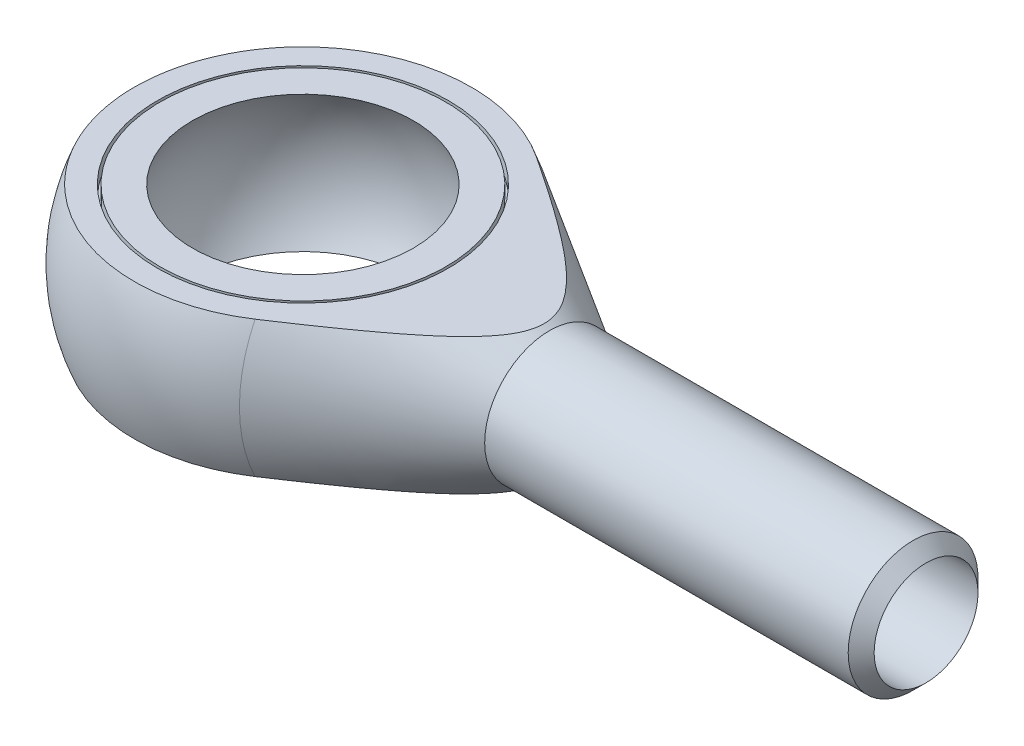
ISO-10303-21;
HEADER;
FILE_DESCRIPTION(('STEP AP214'),'2;1');
FILE_NAME('part.step','',(''),(''),'','','');
FILE_SCHEMA(('AUTOMOTIVE_DESIGN { 1 0 10303 214 1 1 1 1 }'));
ENDSEC;
DATA;
#1=APPLICATION_CONTEXT('core data for automotive mechanical design processes');
#2=APPLICATION_PROTOCOL_DEFINITION('international standard','automotive_design',2000,#1);
#3=PRODUCT_CONTEXT('',#1,'mechanical');
#4=PRODUCT('Part','Part','',(#3));
#5=PRODUCT_RELATED_PRODUCT_CATEGORY('part','',(#4));
#6=PRODUCT_DEFINITION_FORMATION('','',#4);
#7=PRODUCT_DEFINITION_CONTEXT('part definition',#1,'design');
#8=PRODUCT_DEFINITION('design','',#6,#7);
#9=PRODUCT_DEFINITION_SHAPE('','',#8);
#10=(LENGTH_UNIT() NAMED_UNIT(*) SI_UNIT(.MILLI.,.METRE.));
#11=(NAMED_UNIT(*) PLANE_ANGLE_UNIT() SI_UNIT($,.RADIAN.));
#12=(NAMED_UNIT(*) SI_UNIT($,.STERADIAN.) SOLID_ANGLE_UNIT());
#13=UNCERTAINTY_MEASURE_WITH_UNIT(LENGTH_MEASURE(1.E-05),#10,'distance_accuracy_value','');
#14=(GEOMETRIC_REPRESENTATION_CONTEXT(3) GLOBAL_UNCERTAINTY_ASSIGNED_CONTEXT((#13)) GLOBAL_UNIT_ASSIGNED_CONTEXT((#10,
#11,#12)) REPRESENTATION_CONTEXT('',''));
#15=CARTESIAN_POINT('',(0.,0.,0.));
#16=DIRECTION('',(0.,0.,1.));
#17=DIRECTION('',(1.,0.,0.));
#18=AXIS2_PLACEMENT_3D('',#15,#16,#17);
#19=CARTESIAN_POINT('',(-14.,-5.25,-14.));
#20=DIRECTION('',(0.,1.,0.));
#21=DIRECTION('',(-1.,0.,0.));
#22=AXIS2_PLACEMENT_3D('',#19,#20,#21);
#23=PLANE('',#22);
#24=CARTESIAN_POINT('',(-2.62818235817956,-5.25,-17.0529191294828));
#25=CARTESIAN_POINT('',(-2.12503925499544,-5.25,-16.740303282458));
#26=CARTESIAN_POINT('',(-1.62221858295466,-5.25,-16.4271671335793));
#27=CARTESIAN_POINT('',(-0.617367114570737,-5.25,-15.7996232494234));
#28=CARTESIAN_POINT('',(-0.115336323205009,-5.25,-15.4852155061775));
#29=CARTESIAN_POINT('',(0.887915718025678,-5.25,-14.8548186355239));
#30=CARTESIAN_POINT('',(1.38913672077651,-5.25,-14.5388291146458));
#31=CARTESIAN_POINT('',(2.390434330808,-5.25,-13.905043827528));
#32=CARTESIAN_POINT('',(2.89051094079584,-5.25,-13.5872480655673));
#33=CARTESIAN_POINT('',(3.88952679531665,-5.25,-12.949285653447));
#34=CARTESIAN_POINT('',(4.38846528924003,-5.25,-12.6291178270567));
#35=CARTESIAN_POINT('',(5.3845840962432,-5.25,-11.986059462695));
#36=CARTESIAN_POINT('',(5.88176441416815,-5.25,-11.6631689322352));
#37=CARTESIAN_POINT('',(6.87382058369508,-5.25,-11.0140079449249));
#38=CARTESIAN_POINT('',(7.36869673812716,-5.25,-10.6877379515086));
#39=CARTESIAN_POINT('',(8.35552219005812,-5.25,-10.0308094348554));
#40=CARTESIAN_POINT('',(8.84747152387629,-5.25,-9.70015096624085));
#41=CARTESIAN_POINT('',(9.82719732570562,-5.25,-9.0332528700338));
#42=CARTESIAN_POINT('',(10.3149759123961,-5.25,-8.69701636701805));
#43=CARTESIAN_POINT('',(11.042584223956,-5.25,-8.18676697464057));
#44=CARTESIAN_POINT('',(11.2844683213674,-5.25,-8.01568356352145));
#45=CARTESIAN_POINT('',(11.7665787764048,-5.25,-7.67119862410336));
#46=CARTESIAN_POINT('',(12.0068051509764,-5.25,-7.49779711955361));
#47=CARTESIAN_POINT('',(12.4857593495335,-5.25,-7.14785888043862));
#48=CARTESIAN_POINT('',(12.7244828388475,-5.25,-6.97131620446748));
#49=CARTESIAN_POINT('',(13.1994212805954,-5.25,-6.61489315604911));
#50=CARTESIAN_POINT('',(13.4356362927845,-5.25,-6.43501286338981));
#51=CARTESIAN_POINT('',(13.9048300561061,-5.25,-6.07123283389012));
#52=CARTESIAN_POINT('',(14.1378098789113,-5.25,-5.88733448263758));
#53=CARTESIAN_POINT('',(14.5996894514784,-5.25,-5.51449464110692));
#54=CARTESIAN_POINT('',(14.8285894750344,-5.25,-5.32555349139113));
#55=CARTESIAN_POINT('',(15.282237951272,-5.25,-4.94025179508472));
#56=CARTESIAN_POINT('',(15.5069568251484,-5.25,-4.74385630094497));
#57=CARTESIAN_POINT('',(15.9490800000814,-5.25,-4.3426854061068));
#58=CARTESIAN_POINT('',(16.1664805475941,-5.25,-4.13790582106398));
#59=CARTESIAN_POINT('',(16.484175513211,-5.25,-3.82297089010626));
#60=CARTESIAN_POINT('',(16.5885036572486,-5.25,-3.71688406262262));
#61=CARTESIAN_POINT('',(16.7938964577246,-5.25,-3.50160431070215));
#62=CARTESIAN_POINT('',(16.8949614463307,-5.25,-3.39241170455501));
#63=CARTESIAN_POINT('',(17.0930053198843,-5.25,-3.17053617094147));
#64=CARTESIAN_POINT('',(17.1899876198046,-5.25,-3.05785630304538));
#65=CARTESIAN_POINT('',(17.3789511612546,-5.25,-2.82839690184453));
#66=CARTESIAN_POINT('',(17.4709336511534,-5.25,-2.71161840399449));
#67=CARTESIAN_POINT('',(17.6291413848074,-5.25,-2.49944002389789));
#68=CARTESIAN_POINT('',(17.696595836885,-5.25,-2.40495915388657));
#69=CARTESIAN_POINT('',(17.8268589672254,-5.25,-2.21282440774173));
#70=CARTESIAN_POINT('',(17.8896673813928,-5.25,-2.11517035168785));
#71=CARTESIAN_POINT('',(18.009635932278,-5.25,-1.9164265976122));
#72=CARTESIAN_POINT('',(18.0667965305289,-5.25,-1.81533718123305));
#73=CARTESIAN_POINT('',(18.1742438069796,-5.25,-1.6096078237905));
#74=CARTESIAN_POINT('',(18.2245314358917,-5.25,-1.50496837629427));
#75=CARTESIAN_POINT('',(18.3497528940346,-5.25,-1.21600906528184));
#76=CARTESIAN_POINT('',(18.4167302354102,-5.25,-1.02802016789579));
#77=CARTESIAN_POINT('',(18.4930440705706,-5.25,-0.739890839703954));
#78=CARTESIAN_POINT('',(18.5144521575709,-5.25,-0.642871492398333));
#79=CARTESIAN_POINT('',(18.5484628500599,-5.25,-0.447270685231269));
#80=CARTESIAN_POINT('',(18.5610658926043,-5.25,-0.348689303152924));
#81=CARTESIAN_POINT('',(18.5769635243127,-5.25,-0.150015657254014));
#82=CARTESIAN_POINT('',(18.5801863158179,-5.25,-0.0499176044822042));
#83=CARTESIAN_POINT('',(18.5769714195661,-5.25,0.150120621250944));
#84=CARTESIAN_POINT('',(18.5705338544787,-5.25,0.250060796200922));
#85=CARTESIAN_POINT('',(18.5482916604935,-5.25,0.44891994571496));
#86=CARTESIAN_POINT('',(18.5324834582833,-5.25,0.54783851606183));
#87=CARTESIAN_POINT('',(18.4921752626354,-5.25,0.743880072769976));
#88=CARTESIAN_POINT('',(18.4676738423316,-5.25,0.841002761608293));
#89=CARTESIAN_POINT('',(18.4030178370912,-5.25,1.05951947659546));
#90=CARTESIAN_POINT('',(18.360407363697,-5.25,1.18018551122314));
#91=CARTESIAN_POINT('',(18.2645531151317,-5.25,1.41723280305831));
#92=CARTESIAN_POINT('',(18.2113025185034,-5.25,1.5336112544834));
#93=CARTESIAN_POINT('',(18.0959496874158,-5.25,1.76234613587608));
#94=CARTESIAN_POINT('',(18.0338181448365,-5.25,1.8746876430235));
#95=CARTESIAN_POINT('',(17.9025326089589,-5.25,2.095123692322));
#96=CARTESIAN_POINT('',(17.8333797170092,-5.25,2.20321889685798));
#97=CARTESIAN_POINT('',(17.6573498992889,-5.25,2.46282784370737));
#98=CARTESIAN_POINT('',(17.5473864507267,-5.25,2.61224250439258));
#99=CARTESIAN_POINT('',(17.3186817963039,-5.25,2.9042315509107));
#100=CARTESIAN_POINT('',(17.1999358030278,-5.25,3.04680213512871));
#101=CARTESIAN_POINT('',(16.9555901353059,-5.25,3.32643804958606));
#102=CARTESIAN_POINT('',(16.8299765619883,-5.25,3.46349116141572));
#103=CARTESIAN_POINT('',(16.5736806662698,-5.25,3.73269293974768));
#104=CARTESIAN_POINT('',(16.4429993375533,-5.25,3.86484255788085));
#105=CARTESIAN_POINT('',(16.1759566610267,-5.25,4.12669787579271));
#106=CARTESIAN_POINT('',(16.0395443093411,-5.25,4.25635135774169));
#107=CARTESIAN_POINT('',(15.7634463943519,-5.25,4.51212441398327));
#108=CARTESIAN_POINT('',(15.6237606979427,-5.25,4.63824384410948));
#109=CARTESIAN_POINT('',(15.3419298093293,-5.25,4.8873101582602));
#110=CARTESIAN_POINT('',(15.1997881764243,-5.25,5.01026107978952));
#111=CARTESIAN_POINT('',(14.9133363689628,-5.25,5.25359292827943));
#112=CARTESIAN_POINT('',(14.769026281115,-5.25,5.37397395753738));
#113=CARTESIAN_POINT('',(14.4477350601348,-5.25,5.63787621994563));
#114=CARTESIAN_POINT('',(14.2703280946363,-5.25,5.78087853406915));
#115=CARTESIAN_POINT('',(13.9133412580273,-5.25,6.0641479750078));
#116=CARTESIAN_POINT('',(13.7337613250484,-5.25,6.20441502364662));
#117=CARTESIAN_POINT('',(13.1923063020175,-5.25,6.62177574528827));
#118=CARTESIAN_POINT('',(12.8277547678615,-5.25,6.89539748447187));
#119=CARTESIAN_POINT('',(12.0934702302581,-5.25,7.4359017097799));
#120=CARTESIAN_POINT('',(11.7237349982163,-5.25,7.70278114989576));
#121=CARTESIAN_POINT('',(10.9805280997887,-5.25,8.2312963803654));
#122=CARTESIAN_POINT('',(10.6070563383385,-5.25,8.49293203679625));
#123=CARTESIAN_POINT('',(9.85639903737001,-5.25,9.01270604814966));
#124=CARTESIAN_POINT('',(9.47920685092815,-5.25,9.27083478277498));
#125=CARTESIAN_POINT('',(8.72259081692942,-5.25,9.78380733628525));
#126=CARTESIAN_POINT('',(8.34316693940603,-5.25,10.0386511109134));
#127=CARTESIAN_POINT('',(7.58265098105799,-5.25,10.5456024384322));
#128=CARTESIAN_POINT('',(7.20155939730992,-5.25,10.7977107378063));
#129=CARTESIAN_POINT('',(6.43793449283945,-5.25,11.2997341533576));
#130=CARTESIAN_POINT('',(6.05540116898126,-5.25,11.5496492647606));
#131=CARTESIAN_POINT('',(4.99343088142394,-5.25,12.2398634735995));
#132=CARTESIAN_POINT('',(4.31273060646974,-5.25,12.67821851924));
#133=CARTESIAN_POINT('',(2.94857560369635,-5.25,13.5507372381671));
#134=CARTESIAN_POINT('',(2.2651206545807,-5.25,13.9849005648002));
#135=CARTESIAN_POINT('',(0.899005973709454,-5.25,14.8482114756042));
#136=CARTESIAN_POINT('',(0.216354652490301,-5.25,15.2773723802271));
#137=CARTESIAN_POINT('',(-1.15047237131164,-5.25,16.1331105629131));
#138=CARTESIAN_POINT('',(-1.83464791706178,-5.25,16.5596880913868));
#139=CARTESIAN_POINT('',(-2.51940505629375,-5.25,16.9853239876288));
#140=B_SPLINE_CURVE_WITH_KNOTS('',3,(#24,#25,#26,#27,#28,#29,#30,#31,#32,#33,#34,#35,#36,#37,
#38,#39,#40,#41,#42,#43,#44,#45,#46,#47,#48,#49,#50,#51,#52,#53,#54,#55,#56,#57,#58,#59,#60,#61,
#62,#63,#64,#65,#66,#67,#68,#69,#70,#71,#72,#73,#74,#75,#76,#77,#78,#79,#80,#81,#82,#83,#84,#85,
#86,#87,#88,#89,#90,#91,#92,#93,#94,#95,#96,#97,#98,#99,#100,#101,#102,#103,#104,#105,#106,#107,
#108,#109,#110,#111,#112,#113,#114,#115,#116,#117,#118,#119,#120,#121,#122,#123,#124,#125,#126,
#127,#128,#129,#130,#131,#132,#133,#134,#135,#136,#137,#138,#139),.UNSPECIFIED.,.F.,.F.,(4,2,2,
2,2,2,2,2,2,2,2,2,2,2,2,2,2,2,2,2,2,2,2,2,2,2,2,2,2,2,2,2,2,2,2,2,2,2,2,2,2,2,2,2,2,2,2,2,2,2,2,
2,2,2,2,2,2,4),(0.,1.77705867525193,3.55412850410732,5.33166484098367,7.1091969685531,
8.88767899646891,10.6661561194538,12.4443925020109,14.222606771986,15.9998565154504,
16.888663635955,17.7774616574648,18.6681714167051,19.5588599103007,20.4492459606338,
21.3395720306826,22.2347709687872,23.1304222643625,23.5767423874506,24.0230169339339,
24.4689104590565,24.9146921357371,25.2628458954984,25.6110194302212,25.9591644890214,
26.3072613413689,26.9032888932806,27.201016684591,27.4987296965497,27.7987155262954,
28.0986975467798,28.3987940332906,28.6989397991018,29.0822160341973,29.4657387833532,
29.8505577463786,30.2353164407978,30.7914004098707,31.3477897698923,31.9053501578489,
32.4628017668784,33.0273200934349,33.5918614152522,34.1556437112237,34.7194035232227,
35.4029674555354,36.086550896162,37.4538676290173,38.8217914190748,40.1897501006391,
41.5609109641764,42.9320902815018,44.3028854988715,45.6736836994411,48.1025633447862,
50.5316421659497,52.950670300135,55.3694600757206),.UNSPECIFIED.);
#141=CARTESIAN_POINT('',(7.14797043355877,-5.25,10.832544423217));
#142=VERTEX_POINT('',#141);
#143=CARTESIAN_POINT('',(7.14797043355877,-5.25,-10.832544423217));
#144=VERTEX_POINT('',#143);
#145=EDGE_CURVE('E41',#142,#144,#140,.F.);
#146=ORIENTED_EDGE('',*,*,#145,.F.);
#147=CARTESIAN_POINT('',(0.,-5.25,0.));
#148=DIRECTION('',(0.,1.,0.));
#149=DIRECTION('',(-1.,0.,0.));
#150=AXIS2_PLACEMENT_3D('',#147,#148,#149);
#151=CIRCLE('',#150,12.9783473524174);
#152=EDGE_CURVE('E47',#144,#142,#151,.T.);
#153=ORIENTED_EDGE('',*,*,#152,.F.);
#154=EDGE_LOOP('',(#146,#153));
#155=FACE_BOUND('',#154,.T.);
#156=CARTESIAN_POINT('',(0.,-5.25,0.));
#157=DIRECTION('',(0.,1.,0.));
#158=DIRECTION('',(0.,0.,1.));
#159=AXIS2_PLACEMENT_3D('',#156,#157,#158);
#160=CIRCLE('',#159,11.2);
#161=CARTESIAN_POINT('',(0.,-5.25,11.2));
#162=VERTEX_POINT('',#161);
#163=EDGE_CURVE('E157',#162,#162,#160,.T.);
#164=ORIENTED_EDGE('',*,*,#163,.T.);
#165=EDGE_LOOP('',(#164));
#166=FACE_BOUND('',#165,.T.);
#167=ADVANCED_FACE('F33',(#155,#166),#23,.F.);
#168=CARTESIAN_POINT('',(0.,-5.25,0.));
#169=DIRECTION('',(0.,1.,0.));
#170=DIRECTION('',(-1.,0.,0.));
#171=AXIS2_PLACEMENT_3D('',#168,#169,#170);
#172=CIRCLE('',#171,8.5110222652746);
#173=CARTESIAN_POINT('',(8.5110222652746,-5.25,0.));
#174=VERTEX_POINT('',#173);
#175=EDGE_CURVE('E172',#174,#174,#172,.F.);
#176=ORIENTED_EDGE('',*,*,#175,.F.);
#177=EDGE_LOOP('',(#176));
#178=FACE_BOUND('',#177,.T.);
#179=CARTESIAN_POINT('',(0.,-5.25,0.));
#180=DIRECTION('',(0.,1.,0.));
#181=DIRECTION('',(0.,0.,1.));
#182=AXIS2_PLACEMENT_3D('',#179,#180,#181);
#183=CIRCLE('',#182,11.);
#184=CARTESIAN_POINT('',(0.,-5.25,11.));
#185=VERTEX_POINT('',#184);
#186=EDGE_CURVE('E144',#185,#185,#183,.T.);
#187=ORIENTED_EDGE('',*,*,#186,.F.);
#188=EDGE_LOOP('',(#187));
#189=FACE_BOUND('',#188,.T.);
#190=ADVANCED_FACE('F91',(#178,#189),#23,.F.);
#191=CARTESIAN_POINT('',(-14.,5.25,-14.));
#192=DIRECTION('',(0.,-1.,0.));
#193=DIRECTION('',(1.,0.,0.));
#194=AXIS2_PLACEMENT_3D('',#191,#192,#193);
#195=PLANE('',#194);
#196=CARTESIAN_POINT('',(0.,5.25,0.));
#197=DIRECTION('',(0.,-1.,0.));
#198=DIRECTION('',(1.,0.,0.));
#199=AXIS2_PLACEMENT_3D('',#196,#197,#198);
#200=CIRCLE('',#199,8.5110222652746);
#201=CARTESIAN_POINT('',(8.5110222652746,5.25,0.));
#202=VERTEX_POINT('',#201);
#203=EDGE_CURVE('E69',#202,#202,#200,.F.);
#204=ORIENTED_EDGE('',*,*,#203,.F.);
#205=EDGE_LOOP('',(#204));
#206=FACE_BOUND('',#205,.T.);
#207=CARTESIAN_POINT('',(0.,5.25,0.));
#208=DIRECTION('',(0.,1.,0.));
#209=DIRECTION('',(0.,0.,1.));
#210=AXIS2_PLACEMENT_3D('',#207,#208,#209);
#211=CIRCLE('',#210,11.);
#212=CARTESIAN_POINT('',(0.,5.25,11.));
#213=VERTEX_POINT('',#212);
#214=EDGE_CURVE('E160',#213,#213,#211,.T.);
#215=ORIENTED_EDGE('',*,*,#214,.T.);
#216=EDGE_LOOP('',(#215));
#217=FACE_BOUND('',#216,.T.);
#218=ADVANCED_FACE('F87',(#206,#217),#195,.F.);
#219=CARTESIAN_POINT('',(-2.62818235817956,5.25,-17.0529191294828));
#220=CARTESIAN_POINT('',(-2.12503925499544,5.25,-16.740303282458));
#221=CARTESIAN_POINT('',(-1.62221858295466,5.25,-16.4271671335793));
#222=CARTESIAN_POINT('',(-0.617367114570737,5.25,-15.7996232494234));
#223=CARTESIAN_POINT('',(-0.115336323205009,5.25,-15.4852155061775));
#224=CARTESIAN_POINT('',(0.887915718025678,5.25,-14.8548186355239));
#225=CARTESIAN_POINT('',(1.38913672077651,5.25,-14.5388291146458));
#226=CARTESIAN_POINT('',(2.390434330808,5.25,-13.905043827528));
#227=CARTESIAN_POINT('',(2.89051094079584,5.25,-13.5872480655673));
#228=CARTESIAN_POINT('',(3.88952679531665,5.25,-12.949285653447));
#229=CARTESIAN_POINT('',(4.38846528924003,5.25,-12.6291178270567));
#230=CARTESIAN_POINT('',(5.3845840962432,5.25,-11.986059462695));
#231=CARTESIAN_POINT('',(5.88176441416815,5.25,-11.6631689322352));
#232=CARTESIAN_POINT('',(6.87382058369508,5.25,-11.0140079449249));
#233=CARTESIAN_POINT('',(7.36869673812716,5.25,-10.6877379515086));
#234=CARTESIAN_POINT('',(8.35552219005812,5.25,-10.0308094348554));
#235=CARTESIAN_POINT('',(8.84747152387629,5.25,-9.70015096624085));
#236=CARTESIAN_POINT('',(9.82719732570562,5.25,-9.0332528700338));
#237=CARTESIAN_POINT('',(10.3149759123961,5.25,-8.69701636701805));
#238=CARTESIAN_POINT('',(11.042584223956,5.25,-8.18676697464057));
#239=CARTESIAN_POINT('',(11.2844683213674,5.25,-8.01568356352145));
#240=CARTESIAN_POINT('',(11.7665787764048,5.25,-7.67119862410336));
#241=CARTESIAN_POINT('',(12.0068051509764,5.25,-7.49779711955361));
#242=CARTESIAN_POINT('',(12.4857593495335,5.25,-7.14785888043862));
#243=CARTESIAN_POINT('',(12.7244828388475,5.25,-6.97131620446748));
#244=CARTESIAN_POINT('',(13.1994212805954,5.25,-6.61489315604911));
#245=CARTESIAN_POINT('',(13.4356362927845,5.25,-6.43501286338981));
#246=CARTESIAN_POINT('',(13.9048300561061,5.25,-6.07123283389012));
#247=CARTESIAN_POINT('',(14.1378098789113,5.25,-5.88733448263758));
#248=CARTESIAN_POINT('',(14.5996894514784,5.25,-5.51449464110692));
#249=CARTESIAN_POINT('',(14.8285894750344,5.25,-5.32555349139113));
#250=CARTESIAN_POINT('',(15.282237951272,5.25,-4.94025179508472));
#251=CARTESIAN_POINT('',(15.5069568251484,5.25,-4.74385630094497));
#252=CARTESIAN_POINT('',(15.9490800000814,5.25,-4.3426854061068));
#253=CARTESIAN_POINT('',(16.1664805475941,5.25,-4.13790582106398));
#254=CARTESIAN_POINT('',(16.484175513211,5.25,-3.82297089010626));
#255=CARTESIAN_POINT('',(16.5885036572486,5.25,-3.71688406262262));
#256=CARTESIAN_POINT('',(16.7938964577246,5.25,-3.50160431070215));
#257=CARTESIAN_POINT('',(16.8949614463307,5.25,-3.39241170455501));
#258=CARTESIAN_POINT('',(17.0930053198843,5.25,-3.17053617094147));
#259=CARTESIAN_POINT('',(17.1899876198046,5.25,-3.05785630304538));
#260=CARTESIAN_POINT('',(17.3789511612546,5.25,-2.82839690184453));
#261=CARTESIAN_POINT('',(17.4709336511534,5.25,-2.71161840399449));
#262=CARTESIAN_POINT('',(17.6291413848074,5.25,-2.49944002389789));
#263=CARTESIAN_POINT('',(17.696595836885,5.25,-2.40495915388657));
#264=CARTESIAN_POINT('',(17.8268589672254,5.25,-2.21282440774173));
#265=CARTESIAN_POINT('',(17.8896673813928,5.25,-2.11517035168785));
#266=CARTESIAN_POINT('',(18.009635932278,5.25,-1.9164265976122));
#267=CARTESIAN_POINT('',(18.0667965305289,5.25,-1.81533718123305));
#268=CARTESIAN_POINT('',(18.1742438069796,5.25,-1.6096078237905));
#269=CARTESIAN_POINT('',(18.2245314358917,5.25,-1.50496837629427));
#270=CARTESIAN_POINT('',(18.3497528940346,5.25,-1.21600906528184));
#271=CARTESIAN_POINT('',(18.4167302354102,5.25,-1.02802016789579));
#272=CARTESIAN_POINT('',(18.4930440705706,5.25,-0.739890839703954));
#273=CARTESIAN_POINT('',(18.5144521575709,5.25,-0.642871492398333));
#274=CARTESIAN_POINT('',(18.5484628500599,5.25,-0.447270685231269));
#275=CARTESIAN_POINT('',(18.5610658926043,5.25,-0.348689303152924));
#276=CARTESIAN_POINT('',(18.5769635243127,5.25,-0.150015657254014));
#277=CARTESIAN_POINT('',(18.5801863158179,5.25,-0.0499176044822042));
#278=CARTESIAN_POINT('',(18.5769714195661,5.25,0.150120621250944));
#279=CARTESIAN_POINT('',(18.5705338544787,5.25,0.250060796200922));
#280=CARTESIAN_POINT('',(18.5482916604935,5.25,0.44891994571496));
#281=CARTESIAN_POINT('',(18.5324834582833,5.25,0.54783851606183));
#282=CARTESIAN_POINT('',(18.4921752626354,5.25,0.743880072769976));
#283=CARTESIAN_POINT('',(18.4676738423316,5.25,0.841002761608293));
#284=CARTESIAN_POINT('',(18.4030178370912,5.25,1.05951947659546));
#285=CARTESIAN_POINT('',(18.360407363697,5.25,1.18018551122314));
#286=CARTESIAN_POINT('',(18.2645531151317,5.25,1.41723280305831));
#287=CARTESIAN_POINT('',(18.2113025185034,5.25,1.5336112544834));
#288=CARTESIAN_POINT('',(18.0959496874158,5.25,1.76234613587608));
#289=CARTESIAN_POINT('',(18.0338181448365,5.25,1.8746876430235));
#290=CARTESIAN_POINT('',(17.9025326089589,5.25,2.095123692322));
#291=CARTESIAN_POINT('',(17.8333797170092,5.25,2.20321889685798));
#292=CARTESIAN_POINT('',(17.6573498992889,5.25,2.46282784370737));
#293=CARTESIAN_POINT('',(17.5473864507267,5.25,2.61224250439258));
#294=CARTESIAN_POINT('',(17.3186817963039,5.25,2.9042315509107));
#295=CARTESIAN_POINT('',(17.1999358030278,5.25,3.04680213512871));
#296=CARTESIAN_POINT('',(16.9555901353059,5.25,3.32643804958606));
#297=CARTESIAN_POINT('',(16.8299765619883,5.25,3.46349116141572));
#298=CARTESIAN_POINT('',(16.5736806662698,5.25,3.73269293974768));
#299=CARTESIAN_POINT('',(16.4429993375533,5.25,3.86484255788085));
#300=CARTESIAN_POINT('',(16.1759566610267,5.25,4.12669787579271));
#301=CARTESIAN_POINT('',(16.0395443093411,5.25,4.25635135774169));
#302=CARTESIAN_POINT('',(15.7634463943519,5.25,4.51212441398327));
#303=CARTESIAN_POINT('',(15.6237606979427,5.25,4.63824384410948));
#304=CARTESIAN_POINT('',(15.3419298093293,5.25,4.8873101582602));
#305=CARTESIAN_POINT('',(15.1997881764243,5.25,5.01026107978952));
#306=CARTESIAN_POINT('',(14.9133363689628,5.25,5.25359292827943));
#307=CARTESIAN_POINT('',(14.769026281115,5.25,5.37397395753738));
#308=CARTESIAN_POINT('',(14.4477350601348,5.25,5.63787621994563));
#309=CARTESIAN_POINT('',(14.2703280946363,5.25,5.78087853406915));
#310=CARTESIAN_POINT('',(13.9133412580273,5.25,6.0641479750078));
#311=CARTESIAN_POINT('',(13.7337613250484,5.25,6.20441502364662));
#312=CARTESIAN_POINT('',(13.1923063020175,5.25,6.62177574528827));
#313=CARTESIAN_POINT('',(12.8277547678615,5.25,6.89539748447187));
#314=CARTESIAN_POINT('',(12.0934702302581,5.25,7.4359017097799));
#315=CARTESIAN_POINT('',(11.7237349982163,5.25,7.70278114989576));
#316=CARTESIAN_POINT('',(10.9805280997887,5.25,8.2312963803654));
#317=CARTESIAN_POINT('',(10.6070563383385,5.25,8.49293203679625));
#318=CARTESIAN_POINT('',(9.85639903737001,5.25,9.01270604814966));
#319=CARTESIAN_POINT('',(9.47920685092815,5.25,9.27083478277498));
#320=CARTESIAN_POINT('',(8.72259081692942,5.25,9.78380733628525));
#321=CARTESIAN_POINT('',(8.34316693940603,5.25,10.0386511109134));
#322=CARTESIAN_POINT('',(7.58265098105799,5.25,10.5456024384322));
#323=CARTESIAN_POINT('',(7.20155939730992,5.25,10.7977107378063));
#324=CARTESIAN_POINT('',(6.43793449283945,5.25,11.2997341533576));
#325=CARTESIAN_POINT('',(6.05540116898126,5.25,11.5496492647606));
#326=CARTESIAN_POINT('',(4.99343088142394,5.25,12.2398634735995));
#327=CARTESIAN_POINT('',(4.31273060646974,5.25,12.67821851924));
#328=CARTESIAN_POINT('',(2.94857560369635,5.25,13.5507372381671));
#329=CARTESIAN_POINT('',(2.2651206545807,5.25,13.9849005648002));
#330=CARTESIAN_POINT('',(0.899005973709454,5.25,14.8482114756042));
#331=CARTESIAN_POINT('',(0.216354652490301,5.25,15.2773723802271));
#332=CARTESIAN_POINT('',(-1.15047237131164,5.25,16.1331105629131));
#333=CARTESIAN_POINT('',(-1.83464791706178,5.25,16.5596880913868));
#334=CARTESIAN_POINT('',(-2.51940505629375,5.25,16.9853239876288));
#335=B_SPLINE_CURVE_WITH_KNOTS('',3,(#219,#220,#221,#222,#223,#224,#225,#226,#227,#228,#229,
#230,#231,#232,#233,#234,#235,#236,#237,#238,#239,#240,#241,#242,#243,#244,#245,#246,#247,#248,
#249,#250,#251,#252,#253,#254,#255,#256,#257,#258,#259,#260,#261,#262,#263,#264,#265,#266,#267,
#268,#269,#270,#271,#272,#273,#274,#275,#276,#277,#278,#279,#280,#281,#282,#283,#284,#285,#286,
#287,#288,#289,#290,#291,#292,#293,#294,#295,#296,#297,#298,#299,#300,#301,#302,#303,#304,#305,
#306,#307,#308,#309,#310,#311,#312,#313,#314,#315,#316,#317,#318,#319,#320,#321,#322,#323,#324,
#325,#326,#327,#328,#329,#330,#331,#332,#333,#334),.UNSPECIFIED.,.F.,.F.,(4,2,2,2,2,2,2,2,2,2,2,
2,2,2,2,2,2,2,2,2,2,2,2,2,2,2,2,2,2,2,2,2,2,2,2,2,2,2,2,2,2,2,2,2,2,2,2,2,2,2,2,2,2,2,2,2,2,4),
(0.,1.77705867525193,3.55412850410732,5.33166484098367,7.1091969685531,8.88767899646891,
10.6661561194538,12.4443925020109,14.222606771986,15.9998565154504,16.888663635955,
17.7774616574648,18.6681714167051,19.5588599103007,20.4492459606338,21.3395720306826,
22.2347709687872,23.1304222643625,23.5767423874506,24.0230169339339,24.4689104590565,
24.9146921357371,25.2628458954984,25.6110194302212,25.9591644890214,26.3072613413689,
26.9032888932806,27.201016684591,27.4987296965497,27.7987155262954,28.0986975467798,
28.3987940332906,28.6989397991018,29.0822160341973,29.4657387833532,29.8505577463786,
30.2353164407978,30.7914004098707,31.3477897698923,31.9053501578489,32.4628017668784,
33.0273200934349,33.5918614152522,34.1556437112237,34.7194035232227,35.4029674555354,
36.086550896162,37.4538676290173,38.8217914190748,40.1897501006391,41.5609109641764,
42.9320902815018,44.3028854988715,45.6736836994411,48.1025633447862,50.5316421659497,
52.950670300135,55.3694600757206),.UNSPECIFIED.);
#336=CARTESIAN_POINT('',(7.14797043355878,5.25,-10.832544423217));
#337=VERTEX_POINT('',#336);
#338=CARTESIAN_POINT('',(7.14797043355877,5.25,10.832544423217));
#339=VERTEX_POINT('',#338);
#340=EDGE_CURVE('E64',#337,#339,#335,.T.);
#341=ORIENTED_EDGE('',*,*,#340,.F.);
#342=CARTESIAN_POINT('',(0.,5.25,0.));
#343=DIRECTION('',(0.,-1.,0.));
#344=DIRECTION('',(1.,0.,0.));
#345=AXIS2_PLACEMENT_3D('',#342,#343,#344);
#346=CIRCLE('',#345,12.9783473524174);
#347=EDGE_CURVE('E68',#339,#337,#346,.T.);
#348=ORIENTED_EDGE('',*,*,#347,.F.);
#349=EDGE_LOOP('',(#341,#348));
#350=FACE_BOUND('',#349,.T.);
#351=CARTESIAN_POINT('',(0.,5.25,0.));
#352=DIRECTION('',(0.,1.,0.));
#353=DIRECTION('',(0.,0.,1.));
#354=AXIS2_PLACEMENT_3D('',#351,#352,#353);
#355=CIRCLE('',#354,11.2);
#356=CARTESIAN_POINT('',(0.,5.25,11.2));
#357=VERTEX_POINT('',#356);
#358=EDGE_CURVE('E163',#357,#357,#355,.T.);
#359=ORIENTED_EDGE('',*,*,#358,.F.);
#360=EDGE_LOOP('',(#359));
#361=FACE_BOUND('',#360,.T.);
#362=ADVANCED_FACE('F90',(#350,#361),#195,.F.);
#363=CARTESIAN_POINT('',(0.,0.,0.));
#364=DIRECTION('',(-1.,0.,0.));
#365=DIRECTION('',(0.,0.,-1.));
#366=AXIS2_PLACEMENT_3D('',#363,#364,#365);
#367=SPHERICAL_SURFACE('',#366,14.);
#368=CARTESIAN_POINT('',(7.14797043355877,0.,0.));
#369=DIRECTION('',(-1.,0.,0.));
#370=DIRECTION('',(0.,0.,1.));
#371=AXIS2_PLACEMENT_3D('',#368,#369,#370);
#372=CIRCLE('',#371,12.0377123524767);
#373=EDGE_CURVE('E67',#337,#144,#372,.T.);
#374=ORIENTED_EDGE('',*,*,#373,.T.);
#375=ORIENTED_EDGE('',*,*,#152,.T.);
#376=EDGE_CURVE('E54',#142,#339,#372,.T.);
#377=ORIENTED_EDGE('',*,*,#376,.T.);
#378=ORIENTED_EDGE('',*,*,#347,.T.);
#379=EDGE_LOOP('',(#374,#375,#377,#378));
#380=FACE_BOUND('',#379,.T.);
#381=ADVANCED_FACE('F66',(#380),#367,.T.);
#382=CARTESIAN_POINT('',(19.,0.,0.));
#383=DIRECTION('',(-1.,0.,0.));
#384=DIRECTION('',(0.,0.,1.));
#385=AXIS2_PLACEMENT_3D('',#382,#383,#384);
#386=CONICAL_SURFACE('',#385,5.,0.535846782161462);
#387=ORIENTED_EDGE('',*,*,#376,.F.);
#388=ORIENTED_EDGE('',*,*,#145,.T.);
#389=ORIENTED_EDGE('',*,*,#373,.F.);
#390=ORIENTED_EDGE('',*,*,#340,.T.);
#391=EDGE_LOOP('',(#387,#388,#389,#390));
#392=FACE_BOUND('',#391,.T.);
#393=CARTESIAN_POINT('',(19.,0.,0.));
#394=DIRECTION('',(1.,0.,0.));
#395=DIRECTION('',(0.,0.,-1.));
#396=AXIS2_PLACEMENT_3D('',#393,#394,#395);
#397=CIRCLE('',#396,5.);
#398=CARTESIAN_POINT('',(19.,0.,5.));
#399=VERTEX_POINT('',#398);
#400=EDGE_CURVE('E140',#399,#399,#397,.T.);
#401=ORIENTED_EDGE('',*,*,#400,.F.);
#402=EDGE_LOOP('',(#401));
#403=FACE_BOUND('',#402,.T.);
#404=ADVANCED_FACE('F72',(#392,#403),#386,.T.);
#405=CARTESIAN_POINT('',(0.,0.,0.));
#406=DIRECTION('',(0.,1.,0.));
#407=DIRECTION('',(1.,0.,0.));
#408=AXIS2_PLACEMENT_3D('',#405,#406,#407);
#409=SPHERICAL_SURFACE('',#408,10.);
#410=CARTESIAN_POINT('',(8.5110222652746,-5.25,0.));
#411=CARTESIAN_POINT('',(8.57147622073668,-5.15199686805598,0.));
#412=CARTESIAN_POINT('',(8.63023597393296,-5.05294873214638,0.));
#413=CARTESIAN_POINT('',(8.74430021425778,-4.85288249220074,0.));
#414=CARTESIAN_POINT('',(8.79960470138633,-4.75186438816471,0.));
#415=CARTESIAN_POINT('',(8.90669154803957,-4.54797825177098,0.));
#416=CARTESIAN_POINT('',(8.95847390756427,-4.44511021941328,0.));
#417=CARTESIAN_POINT('',(9.05845494486029,-4.23764710338871,0.));
#418=CARTESIAN_POINT('',(9.10665362263163,-4.13305201972184,0.));
#419=CARTESIAN_POINT('',(9.19940972237268,-3.9222595700734,0.));
#420=CARTESIAN_POINT('',(9.24396714434239,-3.81606220409182,0.));
#421=CARTESIAN_POINT('',(9.32938758255673,-3.60219191589988,0.));
#422=CARTESIAN_POINT('',(9.37025059880136,-3.49451899368952,0.));
#423=CARTESIAN_POINT('',(9.4482334626182,-3.2778260676683,0.));
#424=CARTESIAN_POINT('',(9.48535331019042,-3.16880606385744,0.));
#425=CARTESIAN_POINT('',(9.55580554582315,-2.94954905987119,0.));
#426=CARTESIAN_POINT('',(9.58913793388367,-2.83931205969579,0.));
#427=CARTESIAN_POINT('',(9.65197547738992,-2.61775259948757,0.));
#428=CARTESIAN_POINT('',(9.68148063283565,-2.50643013945474,0.));
#429=CARTESIAN_POINT('',(9.73662850513809,-2.28283259146126,0.));
#430=CARTESIAN_POINT('',(9.7622712219948,-2.17055750350062,0.));
#431=CARTESIAN_POINT('',(9.80966361976378,-1.94518866821076,0.));
#432=CARTESIAN_POINT('',(9.83141330067605,-1.83209492088156,0.));
#433=CARTESIAN_POINT('',(9.87099367446777,-1.60522371226905,0.));
#434=CARTESIAN_POINT('',(9.88882436734721,-1.49144625098575,0.));
#435=CARTESIAN_POINT('',(9.92054548918118,-1.26334337569434,0.));
#436=CARTESIAN_POINT('',(9.9344359181357,-1.14901796168622,0.));
#437=CARTESIAN_POINT('',(9.95825993782072,-0.919955596002297,0.));
#438=CARTESIAN_POINT('',(9.96819352855123,-0.80521864432649,0.));
#439=CARTESIAN_POINT('',(9.98409201885622,-0.575470109417833,0.));
#440=CARTESIAN_POINT('',(9.99005691843071,-0.460458526184983,0.));
#441=CARTESIAN_POINT('',(9.9980109090026,-0.230297961968088,0.));
#442=CARTESIAN_POINT('',(10.,-0.115148980984044,0.));
#443=CARTESIAN_POINT('',(10.,0.115148980984044,0.));
#444=CARTESIAN_POINT('',(9.9980109090026,0.230297961968088,0.));
#445=CARTESIAN_POINT('',(9.99005691843071,0.460458526184983,0.));
#446=CARTESIAN_POINT('',(9.98409201885622,0.575470109417833,0.));
#447=CARTESIAN_POINT('',(9.96819352855123,0.80521864432649,0.));
#448=CARTESIAN_POINT('',(9.95825993782072,0.919955596002297,0.));
#449=CARTESIAN_POINT('',(9.9344359181357,1.14901796168622,0.));
#450=CARTESIAN_POINT('',(9.92054548918118,1.26334337569434,0.));
#451=CARTESIAN_POINT('',(9.88882436734721,1.49144625098575,0.));
#452=CARTESIAN_POINT('',(9.87099367446777,1.60522371226905,0.));
#453=CARTESIAN_POINT('',(9.83141330067605,1.83209492088156,0.));
#454=CARTESIAN_POINT('',(9.80966361976378,1.94518866821076,0.));
#455=CARTESIAN_POINT('',(9.7622712219948,2.17055750350062,0.));
#456=CARTESIAN_POINT('',(9.73662850513809,2.28283259146126,0.));
#457=CARTESIAN_POINT('',(9.68148063283565,2.50643013945474,0.));
#458=CARTESIAN_POINT('',(9.65197547738992,2.61775259948757,0.));
#459=CARTESIAN_POINT('',(9.58913793388367,2.83931205969579,0.));
#460=CARTESIAN_POINT('',(9.55580554582315,2.94954905987119,0.));
#461=CARTESIAN_POINT('',(9.48535331019042,3.16880606385744,0.));
#462=CARTESIAN_POINT('',(9.4482334626182,3.2778260676683,0.));
#463=CARTESIAN_POINT('',(9.37025059880136,3.49451899368952,0.));
#464=CARTESIAN_POINT('',(9.32938758255673,3.60219191589988,0.));
#465=CARTESIAN_POINT('',(9.24396714434239,3.81606220409182,0.));
#466=CARTESIAN_POINT('',(9.19940972237268,3.9222595700734,0.));
#467=CARTESIAN_POINT('',(9.10665362263163,4.13305201972184,0.));
#468=CARTESIAN_POINT('',(9.05845494486029,4.23764710338871,0.));
#469=CARTESIAN_POINT('',(8.95847390756427,4.44511021941328,0.));
#470=CARTESIAN_POINT('',(8.90669154803957,4.54797825177098,0.));
#471=CARTESIAN_POINT('',(8.79960470138633,4.75186438816471,0.));
#472=CARTESIAN_POINT('',(8.74430021425778,4.85288249220074,0.));
#473=CARTESIAN_POINT('',(8.63023597393296,5.05294873214638,0.));
#474=CARTESIAN_POINT('',(8.57147622073668,5.15199686805598,0.));
#475=CARTESIAN_POINT('',(8.5110222652746,5.25,0.));
#476=B_SPLINE_CURVE_WITH_KNOTS('',3,(#410,#411,#412,#413,#414,#415,#416,#417,#418,#419,#420,
#421,#422,#423,#424,#425,#426,#427,#428,#429,#430,#431,#432,#433,#434,#435,#436,#437,#438,#439,
#440,#441,#442,#443,#444,#445,#446,#447,#448,#449,#450,#451,#452,#453,#454,#455,#456,#457,#458,
#459,#460,#461,#462,#463,#464,#465,#466,#467,#468,#469,#470,#471,#472,#473,#474,#475),
.UNSPECIFIED.,.F.,.F.,(4,2,2,2,2,2,2,2,2,2,2,2,2,2,2,2,2,2,2,2,2,2,2,2,2,2,2,2,2,2,2,2,4),(0.,
0.345429769514631,0.690859539029263,1.03628930854389,1.38171907805853,1.72714884757316,
2.07257861708779,2.41800838660242,2.76343815611705,3.10886792563169,3.45429769514632,
3.79972746466095,4.14515723417558,4.49058700369021,4.83601677320484,5.18144654271948,
5.52687631223411,5.87230608174874,6.21773585126337,6.563165620778,6.90859539029263,
7.25402515980726,7.5994549293219,7.94488469883653,8.29031446835116,8.63574423786579,
8.98117400738042,9.32660377689505,9.67203354640968,10.0174633159243,10.3628930854389,
10.7083228549536,11.0537526244682),.UNSPECIFIED.);
#477=EDGE_CURVE('BSEAM96',#174,#202,#476,.T.);
#478=ORIENTED_EDGE('',*,*,#175,.T.);
#479=ORIENTED_EDGE('',*,*,#203,.T.);
#480=ORIENTED_EDGE('',*,*,#477,.T.);
#481=ORIENTED_EDGE('',*,*,#477,.F.);
#482=EDGE_LOOP('',(#478,#480,#479,#481));
#483=FACE_BOUND('',#482,.T.);
#484=ADVANCED_FACE('F96',(#483),#409,.F.);
#485=CARTESIAN_POINT('',(0.,13.9759981284706,0.));
#486=DIRECTION('',(0.,1.,0.));
#487=DIRECTION('',(0.,0.,1.));
#488=AXIS2_PLACEMENT_3D('',#485,#486,#487);
#489=CYLINDRICAL_SURFACE('',#488,11.);
#490=CARTESIAN_POINT('',(0.,4.25,0.));
#491=DIRECTION('',(0.,1.,0.));
#492=DIRECTION('',(0.,0.,1.));
#493=AXIS2_PLACEMENT_3D('',#490,#491,#492);
#494=CIRCLE('',#493,11.);
#495=CARTESIAN_POINT('',(0.,4.25,11.));
#496=VERTEX_POINT('',#495);
#497=EDGE_CURVE('E169',#496,#496,#494,.T.);
#498=ORIENTED_EDGE('',*,*,#497,.T.);
#499=EDGE_LOOP('',(#498));
#500=FACE_BOUND('',#499,.T.);
#501=ORIENTED_EDGE('',*,*,#214,.F.);
#502=EDGE_LOOP('',(#501));
#503=FACE_BOUND('',#502,.T.);
#504=ADVANCED_FACE('F99',(#500,#503),#489,.T.);
#505=CARTESIAN_POINT('',(11.,4.25,0.));
#506=DIRECTION('',(0.,1.,0.));
#507=DIRECTION('',(0.,0.,1.));
#508=AXIS2_PLACEMENT_3D('',#505,#506,#507);
#509=PLANE('',#508);
#510=CARTESIAN_POINT('',(0.,4.25,0.));
#511=DIRECTION('',(0.,1.,0.));
#512=DIRECTION('',(0.,0.,1.));
#513=AXIS2_PLACEMENT_3D('',#510,#511,#512);
#514=CIRCLE('',#513,11.2);
#515=CARTESIAN_POINT('',(0.,4.25,11.2));
#516=VERTEX_POINT('',#515);
#517=EDGE_CURVE('E166',#516,#516,#514,.T.);
#518=ORIENTED_EDGE('',*,*,#517,.T.);
#519=EDGE_LOOP('',(#518));
#520=FACE_BOUND('',#519,.T.);
#521=ORIENTED_EDGE('',*,*,#497,.F.);
#522=EDGE_LOOP('',(#521));
#523=FACE_BOUND('',#522,.T.);
#524=ADVANCED_FACE('F103',(#520,#523),#509,.T.);
#525=CARTESIAN_POINT('',(0.,13.9759981284706,0.));
#526=DIRECTION('',(0.,1.,0.));
#527=DIRECTION('',(0.,0.,1.));
#528=AXIS2_PLACEMENT_3D('',#525,#526,#527);
#529=CYLINDRICAL_SURFACE('',#528,11.2);
#530=ORIENTED_EDGE('',*,*,#358,.T.);
#531=EDGE_LOOP('',(#530));
#532=FACE_BOUND('',#531,.T.);
#533=ORIENTED_EDGE('',*,*,#517,.F.);
#534=EDGE_LOOP('',(#533));
#535=FACE_BOUND('',#534,.T.);
#536=ADVANCED_FACE('F107',(#532,#535),#529,.F.);
#537=CARTESIAN_POINT('',(0.,13.9759981284706,0.));
#538=DIRECTION('',(0.,1.,0.));
#539=DIRECTION('',(0.,0.,1.));
#540=AXIS2_PLACEMENT_3D('',#537,#538,#539);
#541=CYLINDRICAL_SURFACE('',#540,11.2);
#542=CARTESIAN_POINT('',(0.,-4.25,0.));
#543=DIRECTION('',(0.,1.,0.));
#544=DIRECTION('',(0.,0.,1.));
#545=AXIS2_PLACEMENT_3D('',#542,#543,#544);
#546=CIRCLE('',#545,11.2);
#547=CARTESIAN_POINT('',(0.,-4.25,11.2));
#548=VERTEX_POINT('',#547);
#549=EDGE_CURVE('E154',#548,#548,#546,.T.);
#550=ORIENTED_EDGE('',*,*,#549,.T.);
#551=EDGE_LOOP('',(#550));
#552=FACE_BOUND('',#551,.T.);
#553=ORIENTED_EDGE('',*,*,#163,.F.);
#554=EDGE_LOOP('',(#553));
#555=FACE_BOUND('',#554,.T.);
#556=ADVANCED_FACE('F111',(#552,#555),#541,.F.);
#557=CARTESIAN_POINT('',(11.,-4.25,0.));
#558=DIRECTION('',(0.,-1.,0.));
#559=DIRECTION('',(0.,0.,-1.));
#560=AXIS2_PLACEMENT_3D('',#557,#558,#559);
#561=PLANE('',#560);
#562=CARTESIAN_POINT('',(0.,-4.25,0.));
#563=DIRECTION('',(0.,1.,0.));
#564=DIRECTION('',(0.,0.,1.));
#565=AXIS2_PLACEMENT_3D('',#562,#563,#564);
#566=CIRCLE('',#565,11.);
#567=CARTESIAN_POINT('',(0.,-4.25,11.));
#568=VERTEX_POINT('',#567);
#569=EDGE_CURVE('E151',#568,#568,#566,.T.);
#570=ORIENTED_EDGE('',*,*,#569,.T.);
#571=EDGE_LOOP('',(#570));
#572=FACE_BOUND('',#571,.T.);
#573=ORIENTED_EDGE('',*,*,#549,.F.);
#574=EDGE_LOOP('',(#573));
#575=FACE_BOUND('',#574,.T.);
#576=ADVANCED_FACE('F115',(#572,#575),#561,.T.);
#577=CARTESIAN_POINT('',(0.,13.9759981284706,0.));
#578=DIRECTION('',(0.,1.,0.));
#579=DIRECTION('',(0.,0.,1.));
#580=AXIS2_PLACEMENT_3D('',#577,#578,#579);
#581=CYLINDRICAL_SURFACE('',#580,11.);
#582=ORIENTED_EDGE('',*,*,#186,.T.);
#583=EDGE_LOOP('',(#582));
#584=FACE_BOUND('',#583,.T.);
#585=ORIENTED_EDGE('',*,*,#569,.F.);
#586=EDGE_LOOP('',(#585));
#587=FACE_BOUND('',#586,.T.);
#588=ADVANCED_FACE('F119',(#584,#587),#581,.T.);
#589=CARTESIAN_POINT('',(48.,0.,0.));
#590=DIRECTION('',(-1.,0.,0.));
#591=DIRECTION('',(0.,0.,1.));
#592=AXIS2_PLACEMENT_3D('',#589,#590,#591);
#593=CYLINDRICAL_SURFACE('',#592,5.);
#594=CARTESIAN_POINT('',(47.,0.,0.));
#595=DIRECTION('',(1.,0.,0.));
#596=DIRECTION('',(0.,0.,-1.));
#597=AXIS2_PLACEMENT_3D('',#594,#595,#596);
#598=CIRCLE('',#597,5.);
#599=CARTESIAN_POINT('',(47.,0.,5.));
#600=VERTEX_POINT('',#599);
#601=EDGE_CURVE('E11',#600,#600,#598,.F.);
#602=CARTESIAN_POINT('',(47.,0.,5.));
#603=CARTESIAN_POINT('',(46.7083333333333,0.,5.));
#604=CARTESIAN_POINT('',(46.4166666666667,0.,5.));
#605=CARTESIAN_POINT('',(45.8333333333333,0.,5.));
#606=CARTESIAN_POINT('',(45.5416666666667,0.,5.));
#607=CARTESIAN_POINT('',(44.9583333333333,0.,5.));
#608=CARTESIAN_POINT('',(44.6666666666667,0.,5.));
#609=CARTESIAN_POINT('',(44.0833333333333,0.,5.));
#610=CARTESIAN_POINT('',(43.7916666666667,0.,5.));
#611=CARTESIAN_POINT('',(43.2083333333333,0.,5.));
#612=CARTESIAN_POINT('',(42.9166666666667,0.,5.));
#613=CARTESIAN_POINT('',(42.3333333333333,0.,5.));
#614=CARTESIAN_POINT('',(42.0416666666667,0.,5.));
#615=CARTESIAN_POINT('',(41.4583333333333,0.,5.));
#616=CARTESIAN_POINT('',(41.1666666666667,0.,5.));
#617=CARTESIAN_POINT('',(40.5833333333333,0.,5.));
#618=CARTESIAN_POINT('',(40.2916666666667,0.,5.));
#619=CARTESIAN_POINT('',(39.7083333333333,0.,5.));
#620=CARTESIAN_POINT('',(39.4166666666667,0.,5.));
#621=CARTESIAN_POINT('',(38.8333333333333,0.,5.));
#622=CARTESIAN_POINT('',(38.5416666666667,0.,5.));
#623=CARTESIAN_POINT('',(37.9583333333333,0.,5.));
#624=CARTESIAN_POINT('',(37.6666666666667,0.,5.));
#625=CARTESIAN_POINT('',(37.0833333333333,0.,5.));
#626=CARTESIAN_POINT('',(36.7916666666667,0.,5.));
#627=CARTESIAN_POINT('',(36.2083333333333,0.,5.));
#628=CARTESIAN_POINT('',(35.9166666666667,0.,5.));
#629=CARTESIAN_POINT('',(35.3333333333333,0.,5.));
#630=CARTESIAN_POINT('',(35.0416666666667,0.,5.));
#631=CARTESIAN_POINT('',(34.4583333333333,0.,5.));
#632=CARTESIAN_POINT('',(34.1666666666667,0.,5.));
#633=CARTESIAN_POINT('',(33.5833333333333,0.,5.));
#634=CARTESIAN_POINT('',(33.2916666666667,0.,5.));
#635=CARTESIAN_POINT('',(32.7083333333333,0.,5.));
#636=CARTESIAN_POINT('',(32.4166666666667,0.,5.));
#637=CARTESIAN_POINT('',(31.8333333333333,0.,5.));
#638=CARTESIAN_POINT('',(31.5416666666667,0.,5.));
#639=CARTESIAN_POINT('',(30.9583333333333,0.,5.));
#640=CARTESIAN_POINT('',(30.6666666666667,0.,5.));
#641=CARTESIAN_POINT('',(30.0833333333333,0.,5.));
#642=CARTESIAN_POINT('',(29.7916666666667,0.,5.));
#643=CARTESIAN_POINT('',(29.2083333333333,0.,5.));
#644=CARTESIAN_POINT('',(28.9166666666667,0.,5.));
#645=CARTESIAN_POINT('',(28.3333333333333,0.,5.));
#646=CARTESIAN_POINT('',(28.0416666666667,0.,5.));
#647=CARTESIAN_POINT('',(27.4583333333333,0.,5.));
#648=CARTESIAN_POINT('',(27.1666666666667,0.,5.));
#649=CARTESIAN_POINT('',(26.5833333333333,0.,5.));
#650=CARTESIAN_POINT('',(26.2916666666667,0.,5.));
#651=CARTESIAN_POINT('',(25.7083333333333,0.,5.));
#652=CARTESIAN_POINT('',(25.4166666666667,0.,5.));
#653=CARTESIAN_POINT('',(24.8333333333333,0.,5.));
#654=CARTESIAN_POINT('',(24.5416666666667,0.,5.));
#655=CARTESIAN_POINT('',(23.9583333333333,0.,5.));
#656=CARTESIAN_POINT('',(23.6666666666667,0.,5.));
#657=CARTESIAN_POINT('',(23.0833333333333,0.,5.));
#658=CARTESIAN_POINT('',(22.7916666666667,0.,5.));
#659=CARTESIAN_POINT('',(22.2083333333333,0.,5.));
#660=CARTESIAN_POINT('',(21.9166666666667,0.,5.));
#661=CARTESIAN_POINT('',(21.3333333333333,0.,5.));
#662=CARTESIAN_POINT('',(21.0416666666667,0.,5.));
#663=CARTESIAN_POINT('',(20.4583333333333,0.,5.));
#664=CARTESIAN_POINT('',(20.1666666666667,0.,5.));
#665=CARTESIAN_POINT('',(19.5833333333333,0.,5.));
#666=CARTESIAN_POINT('',(19.2916666666667,0.,5.));
#667=CARTESIAN_POINT('',(19.,0.,5.));
#668=B_SPLINE_CURVE_WITH_KNOTS('',3,(#602,#603,#604,#605,#606,#607,#608,#609,#610,#611,#612,
#613,#614,#615,#616,#617,#618,#619,#620,#621,#622,#623,#624,#625,#626,#627,#628,#629,#630,#631,
#632,#633,#634,#635,#636,#637,#638,#639,#640,#641,#642,#643,#644,#645,#646,#647,#648,#649,#650,
#651,#652,#653,#654,#655,#656,#657,#658,#659,#660,#661,#662,#663,#664,#665,#666,#667),
.UNSPECIFIED.,.F.,.F.,(4,2,2,2,2,2,2,2,2,2,2,2,2,2,2,2,2,2,2,2,2,2,2,2,2,2,2,2,2,2,2,2,4),(0.,
0.875000000000001,1.75,2.625,3.5,4.375,5.25,6.12500000000001,7.00000000000001,7.87500000000001,
8.75000000000001,9.62500000000001,10.5,11.375,12.25,13.125,14.,14.875,15.75,16.625,17.5,18.375,
19.25,20.125,21.,21.875,22.75,23.625,24.5,25.375,26.25,27.125,28.),.UNSPECIFIED.);
#669=EDGE_CURVE('BSEAM123',#600,#399,#668,.T.);
#670=ORIENTED_EDGE('',*,*,#601,.T.);
#671=ORIENTED_EDGE('',*,*,#400,.T.);
#672=ORIENTED_EDGE('',*,*,#669,.T.);
#673=ORIENTED_EDGE('',*,*,#669,.F.);
#674=EDGE_LOOP('',(#670,#672,#671,#673));
#675=FACE_BOUND('',#674,.T.);
#676=ADVANCED_FACE('F123',(#675),#593,.T.);
#677=CARTESIAN_POINT('',(48.,0.,0.));
#678=DIRECTION('',(-1.,0.,0.));
#679=DIRECTION('',(0.,0.,1.));
#680=AXIS2_PLACEMENT_3D('',#677,#678,#679);
#681=CONICAL_SURFACE('',#680,4.00000000000002,0.785398163397447);
#682=ORIENTED_EDGE('',*,*,#601,.F.);
#683=EDGE_LOOP('',(#682));
#684=FACE_BOUND('',#683,.T.);
#685=CARTESIAN_POINT('',(48.,0.,0.));
#686=DIRECTION('',(1.,0.,0.));
#687=DIRECTION('',(0.,0.,-1.));
#688=AXIS2_PLACEMENT_3D('',#685,#686,#687);
#689=CIRCLE('',#688,4.00000000000002);
#690=CARTESIAN_POINT('',(48.,0.,-4.00000000000002));
#691=VERTEX_POINT('',#690);
#692=EDGE_CURVE('E141',#691,#691,#689,.T.);
#693=ORIENTED_EDGE('',*,*,#692,.F.);
#694=EDGE_LOOP('',(#693));
#695=FACE_BOUND('',#694,.T.);
#696=ADVANCED_FACE('F35',(#684,#695),#681,.T.);
#697=CARTESIAN_POINT('',(38.,0.,0.));
#698=DIRECTION('',(1.,0.,0.));
#699=DIRECTION('',(0.,0.,-1.));
#700=AXIS2_PLACEMENT_3D('',#697,#698,#699);
#701=CYLINDRICAL_SURFACE('',#700,4.00000000000002);
#702=CARTESIAN_POINT('',(38.,0.,0.));
#703=DIRECTION('',(1.,0.,0.));
#704=DIRECTION('',(0.,0.,-1.));
#705=AXIS2_PLACEMENT_3D('',#702,#703,#704);
#706=CIRCLE('',#705,4.00000000000002);
#707=CARTESIAN_POINT('',(38.,0.,-4.00000000000002));
#708=VERTEX_POINT('',#707);
#709=EDGE_CURVE('E139',#708,#708,#706,.T.);
#710=ORIENTED_EDGE('',*,*,#709,.F.);
#711=EDGE_LOOP('',(#710));
#712=FACE_BOUND('',#711,.T.);
#713=ORIENTED_EDGE('',*,*,#692,.T.);
#714=EDGE_LOOP('',(#713));
#715=FACE_BOUND('',#714,.T.);
#716=ADVANCED_FACE('F128',(#712,#715),#701,.F.);
#717=CARTESIAN_POINT('',(38.,0.,0.));
#718=DIRECTION('',(1.,0.,0.));
#719=DIRECTION('',(0.,0.,-1.));
#720=AXIS2_PLACEMENT_3D('',#717,#718,#719);
#721=PLANE('',#720);
#722=ORIENTED_EDGE('',*,*,#709,.T.);
#723=EDGE_LOOP('',(#722));
#724=FACE_BOUND('',#723,.T.);
#725=ADVANCED_FACE('F131',(#724),#721,.T.);
#726=CLOSED_SHELL('',(#167,#190,#218,#362,#381,#404,#484,#504,#524,#536,#556,#576,#588,#676,
#696,#716,#725));
#727=MANIFOLD_SOLID_BREP('B2',#726);
#728=ADVANCED_BREP_SHAPE_REPRESENTATION('',(#18,#727),#14);
#729=SHAPE_DEFINITION_REPRESENTATION(#9,#728);
ENDSEC;
END-ISO-10303-21;
